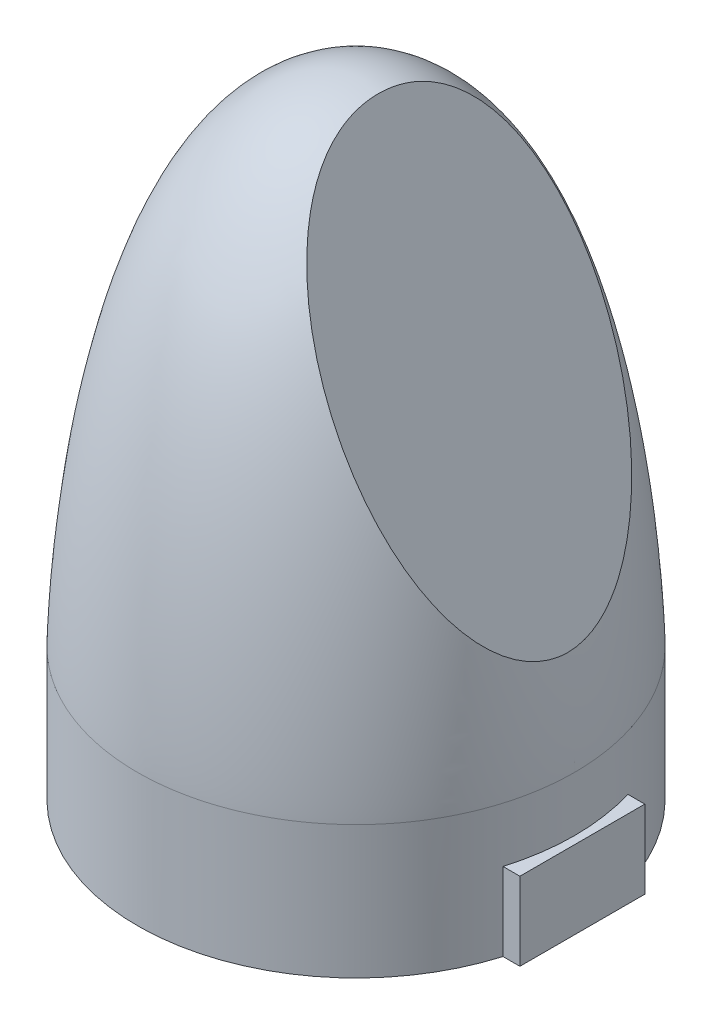
ISO-10303-21;
HEADER;
FILE_DESCRIPTION(('STEP AP214'),'2;1');
FILE_NAME('part.step','',(''),(''),'','','');
FILE_SCHEMA(('AUTOMOTIVE_DESIGN { 1 0 10303 214 1 1 1 1 }'));
ENDSEC;
DATA;
#1=APPLICATION_CONTEXT('core data for automotive mechanical design processes');
#2=APPLICATION_PROTOCOL_DEFINITION('international standard','automotive_design',2000,#1);
#3=PRODUCT_CONTEXT('',#1,'mechanical');
#4=PRODUCT('Part','Part','',(#3));
#5=PRODUCT_RELATED_PRODUCT_CATEGORY('part','',(#4));
#6=PRODUCT_DEFINITION_FORMATION('','',#4);
#7=PRODUCT_DEFINITION_CONTEXT('part definition',#1,'design');
#8=PRODUCT_DEFINITION('design','',#6,#7);
#9=PRODUCT_DEFINITION_SHAPE('','',#8);
#10=(LENGTH_UNIT() NAMED_UNIT(*) SI_UNIT(.MILLI.,.METRE.));
#11=(NAMED_UNIT(*) PLANE_ANGLE_UNIT() SI_UNIT($,.RADIAN.));
#12=(NAMED_UNIT(*) SI_UNIT($,.STERADIAN.) SOLID_ANGLE_UNIT());
#13=UNCERTAINTY_MEASURE_WITH_UNIT(LENGTH_MEASURE(1.E-05),#10,'distance_accuracy_value','');
#14=(GEOMETRIC_REPRESENTATION_CONTEXT(3) GLOBAL_UNCERTAINTY_ASSIGNED_CONTEXT((#13)) GLOBAL_UNIT_ASSIGNED_CONTEXT((#10,
#11,#12)) REPRESENTATION_CONTEXT('',''));
#15=CARTESIAN_POINT('',(0.,0.,0.));
#16=DIRECTION('',(0.,0.,1.));
#17=DIRECTION('',(1.,0.,0.));
#18=AXIS2_PLACEMENT_3D('',#15,#16,#17);
#19=CARTESIAN_POINT('',(0.,-7.91303002861502,1.63207319706783E-06));
#20=DIRECTION('',(0.,-1.,0.));
#21=DIRECTION('',(0.,0.,-1.));
#22=AXIS2_PLACEMENT_3D('',#19,#20,#21);
#23=PLANE('',#22);
#24=CARTESIAN_POINT('',(0.,-7.91303002861502,1.63207319706783E-06));
#25=DIRECTION('',(0.,-1.,0.));
#26=DIRECTION('',(0.,0.,-1.));
#27=AXIS2_PLACEMENT_3D('',#24,#25,#26);
#28=CIRCLE('',#27,14.);
#29=CARTESIAN_POINT('',(13.4164083515888,-7.91303002861502,4.00000000000001));
#30=VERTEX_POINT('',#29);
#31=CARTESIAN_POINT('',(13.4164073784084,-7.91303002861502,-3.99999999999999));
#32=VERTEX_POINT('',#31);
#33=EDGE_CURVE('E131',#30,#32,#28,.T.);
#34=ORIENTED_EDGE('',*,*,#33,.T.);
#35=DIRECTION('',(1.,0.,0.));
#36=VECTOR('',#35,1.);
#37=CARTESIAN_POINT('',(14.5,-7.91303002861502,-4.));
#38=LINE('',#37,#36);
#39=CARTESIAN_POINT('',(14.5,-7.91303002861502,-4.));
#40=VERTEX_POINT('',#39);
#41=EDGE_CURVE('E97',#32,#40,#38,.T.);
#42=ORIENTED_EDGE('',*,*,#41,.T.);
#43=DIRECTION('',(0.,0.,1.));
#44=VECTOR('',#43,1.);
#45=CARTESIAN_POINT('',(14.5,-7.91303002861502,-4.));
#46=LINE('',#45,#44);
#47=CARTESIAN_POINT('',(14.5,-7.91303002861502,4.00000000000001));
#48=VERTEX_POINT('',#47);
#49=EDGE_CURVE('E102',#40,#48,#46,.T.);
#50=ORIENTED_EDGE('',*,*,#49,.T.);
#51=DIRECTION('',(-1.,0.,0.));
#52=VECTOR('',#51,1.);
#53=CARTESIAN_POINT('',(14.5,-7.91303002861502,4.00000000000001));
#54=LINE('',#53,#52);
#55=EDGE_CURVE('E49',#48,#30,#54,.T.);
#56=ORIENTED_EDGE('',*,*,#55,.T.);
#57=EDGE_LOOP('',(#34,#42,#50,#56));
#58=FACE_BOUND('',#57,.T.);
#59=ADVANCED_FACE('F35',(#58),#23,.T.);
#60=CARTESIAN_POINT('',(0.,-7.91303002861502,1.63207319706783E-06));
#61=DIRECTION('',(0.,-1.,0.));
#62=DIRECTION('',(0.,0.,-1.));
#63=AXIS2_PLACEMENT_3D('',#60,#61,#62);
#64=CYLINDRICAL_SURFACE('',#63,14.);
#65=DIRECTION('',(0.,-1.,0.));
#66=VECTOR('',#65,1.);
#67=CARTESIAN_POINT('',(13.4164073784084,-7.91303002861502,-3.99999999999999));
#68=LINE('',#67,#66);
#69=CARTESIAN_POINT('',(13.4164073784084,-2.91303002861502,-3.99999999999999));
#70=VERTEX_POINT('',#69);
#71=EDGE_CURVE('E11',#32,#70,#68,.F.);
#72=ORIENTED_EDGE('',*,*,#71,.F.);
#73=ORIENTED_EDGE('',*,*,#33,.F.);
#74=DIRECTION('',(0.,-1.,0.));
#75=VECTOR('',#74,1.);
#76=CARTESIAN_POINT('',(13.4164083515888,-7.91303002861502,4.00000000000001));
#77=LINE('',#76,#75);
#78=CARTESIAN_POINT('',(13.4164083515888,-2.91303002861502,4.00000000000001));
#79=VERTEX_POINT('',#78);
#80=EDGE_CURVE('E42',#79,#30,#77,.T.);
#81=ORIENTED_EDGE('',*,*,#80,.F.);
#82=CARTESIAN_POINT('',(0.,-2.91303002861502,1.63207319706783E-06));
#83=DIRECTION('',(0.,-1.,0.));
#84=DIRECTION('',(0.,0.,-1.));
#85=AXIS2_PLACEMENT_3D('',#82,#83,#84);
#86=CIRCLE('',#85,14.);
#87=EDGE_CURVE('E92',#79,#70,#86,.F.);
#88=ORIENTED_EDGE('',*,*,#87,.T.);
#89=EDGE_LOOP('',(#72,#73,#81,#88));
#90=FACE_BOUND('',#89,.T.);
#91=CARTESIAN_POINT('',(0.,0.599554023441105,1.63207319706783E-06));
#92=DIRECTION('',(0.,-1.,0.));
#93=DIRECTION('',(0.,0.,-1.));
#94=AXIS2_PLACEMENT_3D('',#91,#92,#93);
#95=CIRCLE('',#94,14.);
#96=CARTESIAN_POINT('',(0.,0.599554023441105,-13.9999983679268));
#97=VERTEX_POINT('',#96);
#98=EDGE_CURVE('E105',#97,#97,#95,.T.);
#99=ORIENTED_EDGE('',*,*,#98,.T.);
#100=EDGE_LOOP('',(#99));
#101=FACE_BOUND('',#100,.T.);
#102=ADVANCED_FACE('F121',(#90,#101),#64,.T.);
#103=CARTESIAN_POINT('',(14.,0.599554023441091,1.63207319706783E-06));
#104=CARTESIAN_POINT('',(14.0101192378029,0.600297963765106,1.63207319706783E-06));
#105=CARTESIAN_POINT('',(13.497519718667,32.0535501950033,1.63207319706783E-06));
#106=CARTESIAN_POINT('',(0.,32.086969971385,1.63207319706783E-06));
#107=B_SPLINE_CURVE_WITH_KNOTS('',3,(#103,#104,#105,#106),.UNSPECIFIED.,.F.,.F.,(4,4),(0.,
0.166417438268429),.UNSPECIFIED.);
#108=CARTESIAN_POINT('',(0.,-7.91303002861502,1.63207319706783E-06));
#109=DIRECTION('',(0.,-1.,0.));
#110=AXIS1_PLACEMENT('',#108,#109);
#111=SURFACE_OF_REVOLUTION('',#107,#110);
#112=CARTESIAN_POINT('',(13.5695925705618,7.03495349548713,1.63207319706783E-06));
#113=CARTESIAN_POINT('',(13.569593111081,7.03495238615009,-0.115935962691736));
#114=CARTESIAN_POINT('',(13.5677017376389,7.03883415783024,-0.231863789741345));
#115=CARTESIAN_POINT('',(13.5601689966265,7.05429402421619,-0.463113613480936));
#116=CARTESIAN_POINT('',(13.554526715549,7.06587399376377,-0.57843545569004));
#117=CARTESIAN_POINT('',(13.5395854771663,7.09653873433856,-0.807815068448769));
#118=CARTESIAN_POINT('',(13.5302870646289,7.11562238730826,-0.921873024716839));
#119=CARTESIAN_POINT('',(13.5081808067805,7.16099229873516,-1.14820576316821));
#120=CARTESIAN_POINT('',(13.4953725740684,7.18727935227742,-1.26048034706125));
#121=CARTESIAN_POINT('',(13.4641002184667,7.25146135962925,-1.50069596285211));
#122=CARTESIAN_POINT('',(13.445057217935,7.290544376454,-1.62824524834484));
#123=CARTESIAN_POINT('',(13.4028369903689,7.37719531476394,-1.87970464842254));
#124=CARTESIAN_POINT('',(13.3796594396676,7.4247639005289,-2.00361447721312));
#125=CARTESIAN_POINT('',(13.3044455699655,7.57912953897566,-2.36935766905935));
#126=CARTESIAN_POINT('',(13.246734797026,7.69757259137201,-2.60515453007807));
#127=CARTESIAN_POINT('',(13.0792809463252,8.04124751032234,-3.20033229330516));
#128=CARTESIAN_POINT('',(12.9595386182557,8.28700139846505,-3.54503548701057));
#129=CARTESIAN_POINT('',(12.7636289989305,8.68907768552191,-4.02670415129678));
#130=CARTESIAN_POINT('',(12.6954726018878,8.82895887745364,-4.18160892362818));
#131=CARTESIAN_POINT('',(12.5545870920375,9.11810610205571,-4.48024095883491));
#132=CARTESIAN_POINT('',(12.4818581996817,9.26737168228025,-4.62396875983492));
#133=CARTESIAN_POINT('',(12.2844743172951,9.67247368200985,-4.99014958880977));
#134=CARTESIAN_POINT('',(12.1565984209263,9.93492054803463,-5.20354939246708));
#135=CARTESIAN_POINT('',(11.8932504340534,10.4754043748651,-5.60440398331515));
#136=CARTESIAN_POINT('',(11.7577734255069,10.7534514292443,-5.79184169415517));
#137=CARTESIAN_POINT('',(11.4809120363106,11.3216695687154,-6.14336078578195));
#138=CARTESIAN_POINT('',(11.3395195596337,11.6118572697371,-6.30740870595594));
#139=CARTESIAN_POINT('',(11.0523536226196,12.2012240099798,-6.61387427767249));
#140=CARTESIAN_POINT('',(10.9065806627114,12.5004020221419,-6.75629438882122));
#141=CARTESIAN_POINT('',(10.6372145804181,13.0532371233513,-6.99819389175374));
#142=CARTESIAN_POINT('',(10.5141615078226,13.3057858379604,-7.10083629662205));
#143=CARTESIAN_POINT('',(10.266126712572,13.8148415437434,-7.2932553568146));
#144=CARTESIAN_POINT('',(10.1411447494743,14.0713490283912,-7.38303039359384));
#145=CARTESIAN_POINT('',(9.88955921589693,14.5876921133629,-7.55034430684583));
#146=CARTESIAN_POINT('',(9.76295491160109,14.8475292197389,-7.62787741847709));
#147=CARTESIAN_POINT('',(9.50846584128399,15.3698313958245,-7.77113080345647));
#148=CARTESIAN_POINT('',(9.38058093973396,15.6322967436874,-7.83684981223705));
#149=CARTESIAN_POINT('',(8.99480154315081,16.4240534115604,-8.01711777693927));
#150=CARTESIAN_POINT('',(8.73532783324459,16.9565858427259,-8.11441970486723));
#151=CARTESIAN_POINT('',(8.21402709922825,18.0264805436358,-8.26468524020296));
#152=CARTESIAN_POINT('',(7.9522006932991,18.5638415446527,-8.31766016917724));
#153=CARTESIAN_POINT('',(7.50750902556991,19.4765071670022,-8.3699952668589));
#154=CARTESIAN_POINT('',(7.3248886181778,19.851309259916,-8.38077243905584));
#155=CARTESIAN_POINT('',(6.95961564994763,20.600979436062,-8.38055717645193));
#156=CARTESIAN_POINT('',(6.77696308799601,20.9758475215797,-8.36956194015509));
#157=CARTESIAN_POINT('',(6.41209728568607,21.7246820482973,-8.32505448639336));
#158=CARTESIAN_POINT('',(6.2298842785092,22.0986480109258,-8.29153219449331));
#159=CARTESIAN_POINT('',(5.86728178438736,22.8428374234531,-8.20100542017854));
#160=CARTESIAN_POINT('',(5.68688796714474,23.2130697606643,-8.14409244609434));
#161=CARTESIAN_POINT('',(5.32801042257246,23.9496142505506,-8.00526690446767));
#162=CARTESIAN_POINT('',(5.14952600360483,24.3159278227131,-7.92336372996598));
#163=CARTESIAN_POINT('',(4.79546508716638,25.0425868768416,-7.73257352089771));
#164=CARTESIAN_POINT('',(4.61988621207603,25.4029372385294,-7.62370984497012));
#165=CARTESIAN_POINT('',(4.32539240445965,26.0073433781334,-7.41386222117222));
#166=CARTESIAN_POINT('',(4.20543298191147,26.2535428214368,-7.32049117738945));
#167=CARTESIAN_POINT('',(3.96803166737841,26.7407748390308,-7.11829744784054));
#168=CARTESIAN_POINT('',(3.8505895611237,26.9818078530792,-7.00947608323993));
#169=CARTESIAN_POINT('',(3.61893639897148,27.4572426155169,-6.77520540763167));
#170=CARTESIAN_POINT('',(3.50472486699324,27.6916453409934,-6.64975856232959));
#171=CARTESIAN_POINT('',(3.28041196295403,28.1520152804874,-6.38092333942188));
#172=CARTESIAN_POINT('',(3.17031008170108,28.3779835395481,-6.23753719416755));
#173=CARTESIAN_POINT('',(2.97233370093599,28.7843015568928,-5.95566371149793));
#174=CARTESIAN_POINT('',(2.88369496884013,28.9662197925226,-5.81997899186252));
#175=CARTESIAN_POINT('',(2.71097024865626,29.3207124121993,-5.53417658929666));
#176=CARTESIAN_POINT('',(2.62688431465721,29.4932866852365,-5.3840587349539));
#177=CARTESIAN_POINT('',(2.46439058944298,29.8267816607728,-5.06903302195973));
#178=CARTESIAN_POINT('',(2.38597475201658,29.9877188769619,-4.90414689556671));
#179=CARTESIAN_POINT('',(2.23585880587704,30.295810243071,-4.55912921760212));
#180=CARTESIAN_POINT('',(2.16415669826374,30.4429684954458,-4.37900223433969));
#181=CARTESIAN_POINT('',(2.04407670479046,30.6894153932135,-4.04623563313655));
#182=CARTESIAN_POINT('',(1.99409396407966,30.7919977721245,-3.89660869369195));
#183=CARTESIAN_POINT('',(1.89950679623883,30.9861243156789,-3.58873506093898));
#184=CARTESIAN_POINT('',(1.85490163983911,31.0776699770434,-3.43048954065627));
#185=CARTESIAN_POINT('',(1.77167157698174,31.2484876977887,-3.10613254633115));
#186=CARTESIAN_POINT('',(1.73304254743913,31.3277682192077,-2.94002659965607));
#187=CARTESIAN_POINT('',(1.6622250457882,31.4731109452082,-2.60077902038431));
#188=CARTESIAN_POINT('',(1.63003697730049,31.5391723214165,-2.42763694768865));
#189=CARTESIAN_POINT('',(1.57239630370753,31.6574715049969,-2.07499721271673));
#190=CARTESIAN_POINT('',(1.5469645056908,31.7096666088155,-1.89548180369488));
#191=CARTESIAN_POINT('',(1.50319858550568,31.7994898586808,-1.53204197155543));
#192=CARTESIAN_POINT('',(1.48486287171623,31.8371212713005,-1.34811854697623));
#193=CARTESIAN_POINT('',(1.4553448581792,31.8977027441508,-0.977183425601441));
#194=CARTESIAN_POINT('',(1.44416738569824,31.9206428971117,-0.790169731837354));
#195=CARTESIAN_POINT('',(1.42895044362931,31.9518734798085,-0.414434108559467));
#196=CARTESIAN_POINT('',(1.42491874127721,31.9601479684111,-0.225710544068186));
#197=CARTESIAN_POINT('',(1.42400690458217,31.9620193819436,0.143930900312275));
#198=CARTESIAN_POINT('',(1.42683495728801,31.9562152109413,0.324845403956373));
#199=CARTESIAN_POINT('',(1.43906204675914,31.9311208702295,0.685594032731897));
#200=CARTESIAN_POINT('',(1.44846373484193,31.9118252590726,0.865427692403453));
#201=CARTESIAN_POINT('',(1.47386751976268,31.8596876481002,1.22259303149525));
#202=CARTESIAN_POINT('',(1.48986741936465,31.8268501577952,1.39992552350496));
#203=CARTESIAN_POINT('',(1.52841999257066,31.747726551999,1.75075483186491));
#204=CARTESIAN_POINT('',(1.55096965696794,31.7014466124715,1.92425337037416));
#205=CARTESIAN_POINT('',(1.60251080753621,31.5956658217043,2.26655146825602));
#206=CARTESIAN_POINT('',(1.63151431501456,31.536140298462,2.43534158843063));
#207=CARTESIAN_POINT('',(1.69561194785318,31.4045891356878,2.76659689286819));
#208=CARTESIAN_POINT('',(1.73070079466112,31.3325743296244,2.92906741057632));
#209=CARTESIAN_POINT('',(1.80660384093532,31.1767942554895,3.24703533186243));
#210=CARTESIAN_POINT('',(1.8474225594887,31.0930197126422,3.40252710238237));
#211=CARTESIAN_POINT('',(1.9342792128042,30.9147589371296,3.7057561851056));
#212=CARTESIAN_POINT('',(1.98031889289173,30.8202691224352,3.85349087989193));
#213=CARTESIAN_POINT('',(2.09137058659041,30.5923515100814,4.18314937232851));
#214=CARTESIAN_POINT('',(2.1579714171975,30.455662894292,4.36229317581793));
#215=CARTESIAN_POINT('',(2.29784576848922,30.1685909270472,4.70635476095048));
#216=CARTESIAN_POINT('',(2.37112079142655,30.0182044924345,4.8712693234749));
#217=CARTESIAN_POINT('',(2.59957135235512,29.5493426079053,5.34532503044854));
#218=CARTESIAN_POINT('',(2.7632364540971,29.2134435506978,5.63338815709374));
#219=CARTESIAN_POINT('',(3.06335253823984,28.5974984980057,6.09218704505054));
#220=CARTESIAN_POINT('',(3.19657895696239,28.3240704552054,6.27434608299585));
#221=CARTESIAN_POINT('',(3.46954956358874,27.7638375867734,6.61153737880839));
#222=CARTESIAN_POINT('',(3.60929705867246,27.477025973631,6.76655567858261));
#223=CARTESIAN_POINT('',(3.89375799365458,26.8932108605993,7.0519015053211));
#224=CARTESIAN_POINT('',(4.03847903035531,26.596191769367,7.18218907978723));
#225=CARTESIAN_POINT('',(4.33144124331907,25.9949290072721,7.41996343650344));
#226=CARTESIAN_POINT('',(4.47968223138939,25.690685722648,7.52745143468478));
#227=CARTESIAN_POINT('',(4.74953643860886,25.1368488153067,7.70252116722886));
#228=CARTESIAN_POINT('',(4.8706956287262,24.8881870218073,7.77379676397444));
#229=CARTESIAN_POINT('',(5.1143235547424,24.3881757806371,7.90359441569345));
#230=CARTESIAN_POINT('',(5.2367924458304,24.1368260144631,7.96211494132658));
#231=CARTESIAN_POINT('',(5.60577897053224,23.3795342983281,8.11964016622769));
#232=CARTESIAN_POINT('',(5.85380816803834,22.8704900811097,8.20056527427735));
#233=CARTESIAN_POINT('',(6.3522920829253,21.8474236163507,8.31844954376962));
#234=CARTESIAN_POINT('',(6.6027507181833,21.3333933279313,8.35531861474772));
#235=CARTESIAN_POINT('',(7.10411240815579,20.3044206441446,8.38740792799201));
#236=CARTESIAN_POINT('',(7.35501534963813,19.7894784811699,8.38263758108016));
#237=CARTESIAN_POINT('',(7.86820809565897,18.7362242582516,8.33154894644731));
#238=CARTESIAN_POINT('',(8.13045916712688,18.1979916923587,8.28322423973561));
#239=CARTESIAN_POINT('',(8.65278910521417,17.1259846982756,8.14224487167148));
#240=CARTESIAN_POINT('',(8.91286730109274,16.5922116466843,8.04957700171914));
#241=CARTESIAN_POINT('',(9.29961079452184,15.7984763088434,7.8764022991751));
#242=CARTESIAN_POINT('',(9.42778886701671,15.5354092698263,7.81309245066583));
#243=CARTESIAN_POINT('',(9.68291880517343,15.0117918047705,7.6747310952471));
#244=CARTESIAN_POINT('',(9.80987080234767,14.7512411088216,7.59968086283597));
#245=CARTESIAN_POINT('',(10.0621937686621,14.2333845493308,7.43744414210311));
#246=CARTESIAN_POINT('',(10.1875656885015,13.9760767346159,7.3502653727918));
#247=CARTESIAN_POINT('',(10.4364851752332,13.4652053269437,7.16315043942667));
#248=CARTESIAN_POINT('',(10.5600326245051,13.2116419753856,7.0632134568438));
#249=CARTESIAN_POINT('',(10.8040661526837,12.7107982941748,6.85057826620381));
#250=CARTESIAN_POINT('',(10.92456715733,12.4634873315906,6.73796965042831));
#251=CARTESIAN_POINT('',(11.1628254349411,11.9744965206626,6.49861874455362));
#252=CARTESIAN_POINT('',(11.2805833119411,11.7328154326234,6.37187960224371));
#253=CARTESIAN_POINT('',(11.5128018208414,11.2562203773825,6.1031370649898));
#254=CARTESIAN_POINT('',(11.6272606786049,11.0213100513411,5.96112564425124));
#255=CARTESIAN_POINT('',(11.8519750623534,10.560116132548,5.66067443128469));
#256=CARTESIAN_POINT('',(11.9622311237976,10.3338314408431,5.50223674148624));
#257=CARTESIAN_POINT('',(12.1605913108195,9.92672571641578,5.19372675425537));
#258=CARTESIAN_POINT('',(12.2494613104783,9.74433283741064,5.04622738554583));
#259=CARTESIAN_POINT('',(12.4225816229001,9.38902832162186,4.7375908912396));
#260=CARTESIAN_POINT('',(12.5068313307808,9.21611792627239,4.5764519869635));
#261=CARTESIAN_POINT('',(12.6694427131064,8.88238147645509,4.23993495336355));
#262=CARTESIAN_POINT('',(12.7478153519104,8.7215329192187,4.06458467704947));
#263=CARTESIAN_POINT('',(12.8973860850233,8.41456052434844,3.69876743748846));
#264=CARTESIAN_POINT('',(12.9685883297078,8.26842816866593,3.5083093344417));
#265=CARTESIAN_POINT('',(13.1200427664086,7.95758974339257,3.0584135627423));
#266=CARTESIAN_POINT('',(13.1976275609072,7.79835812316113,2.79414473234098));
#267=CARTESIAN_POINT('',(13.2999280962746,7.58840100331087,2.37992786858826));
#268=CARTESIAN_POINT('',(13.3316784206356,7.52323803389727,2.23890935830274));
#269=CARTESIAN_POINT('',(13.3899211837091,7.40370314834548,1.95127658335797));
#270=CARTESIAN_POINT('',(13.4164142190157,7.34933000778398,1.8046629558832));
#271=CARTESIAN_POINT('',(13.4609372672647,7.25795286157722,1.52307037300803));
#272=CARTESIAN_POINT('',(13.4795788535589,7.21969368968032,1.38859514756734));
#273=CARTESIAN_POINT('',(13.5118472849967,7.15346738008702,1.1165488122648));
#274=CARTESIAN_POINT('',(13.5254750345172,7.12549838628728,0.978978265480491));
#275=CARTESIAN_POINT('',(13.5474031260014,7.0804941356726,0.701736180914162));
#276=CARTESIAN_POINT('',(13.5557073238617,7.06345096518501,0.562066238959865));
#277=CARTESIAN_POINT('',(13.5668013644393,7.0406820441885,0.281593175660219));
#278=CARTESIAN_POINT('',(13.5695919141836,7.0349548426082,0.140790201931328));
#279=CARTESIAN_POINT('',(13.5695925705618,7.03495349548713,1.63207319706783E-06));
#280=B_SPLINE_CURVE_WITH_KNOTS('',3,(#112,#113,#114,#115,#116,#117,#118,#119,#120,#121,#122,
#123,#124,#125,#126,#127,#128,#129,#130,#131,#132,#133,#134,#135,#136,#137,#138,#139,#140,#141,
#142,#143,#144,#145,#146,#147,#148,#149,#150,#151,#152,#153,#154,#155,#156,#157,#158,#159,#160,
#161,#162,#163,#164,#165,#166,#167,#168,#169,#170,#171,#172,#173,#174,#175,#176,#177,#178,#179,
#180,#181,#182,#183,#184,#185,#186,#187,#188,#189,#190,#191,#192,#193,#194,#195,#196,#197,#198,
#199,#200,#201,#202,#203,#204,#205,#206,#207,#208,#209,#210,#211,#212,#213,#214,#215,#216,#217,
#218,#219,#220,#221,#222,#223,#224,#225,#226,#227,#228,#229,#230,#231,#232,#233,#234,#235,#236,
#237,#238,#239,#240,#241,#242,#243,#244,#245,#246,#247,#248,#249,#250,#251,#252,#253,#254,#255,
#256,#257,#258,#259,#260,#261,#262,#263,#264,#265,#266,#267,#268,#269,#270,#271,#272,#273,#274,
#275,#276,#277,#278,#279),.UNSPECIFIED.,.T.,.F.,(4,2,2,2,2,2,2,2,2,2,2,2,2,2,2,2,2,2,2,2,2,2,2,
2,2,2,2,2,2,2,2,2,2,2,2,2,2,2,2,2,2,2,2,2,2,2,2,2,2,2,2,2,2,2,2,2,2,2,2,2,2,2,2,2,2,2,2,2,2,2,2,
2,2,2,2,2,2,2,2,2,2,2,2,4),(0.,0.347716159295487,0.695517033447526,1.04326610449338,
1.39105357428383,1.79489885053381,2.19877575507835,3.00668561334551,4.31863896660072,
4.97698506260486,5.63529944233445,6.71845257087879,7.80231478519259,8.88771230315853,
9.9729862925272,10.869959226273,11.7670448885374,12.6645517452688,13.5621546129397,
15.361236622299,17.1598589874283,18.4105347677635,19.6613714853184,20.9127679683081,
22.1593146846205,23.4053934386869,24.6503963412783,25.5180391595039,26.3856078297446,
27.2530479755795,28.1203802850605,28.8507355379243,29.5810994657818,30.3104057509034,
31.0394942022567,31.6034758257574,32.1673808798473,32.7308951293137,33.2944446801544,
33.8597101705905,34.4248488008347,34.9903681405291,35.5565018065167,36.0989775852064,
36.6416722847401,37.184186410088,37.7264516773611,38.2697355829064,38.8125505682474,
39.3557960966384,39.8992237659745,40.6030565974783,41.3070482437074,42.7165081976705,
43.7788479284005,44.8417324105679,45.9063196353858,46.9708500700895,47.827470522614,
48.6841936279862,50.3981235060452,52.1155522446967,53.8325928415745,55.6330171013461,
57.4339779917843,58.3319896268071,59.2299038441365,60.1272491907471,61.0246521373281,
61.9160675712029,62.8072848240269,63.6989727339226,64.5905466555466,65.3425542907281,
66.0946601438667,66.8453260200137,67.5955548668726,68.5462965756788,69.0215234510275,
69.4966963670369,69.919381622714,70.3419905986029,70.7642931281065,71.18654150132),.UNSPECIFIED.);
#281=CARTESIAN_POINT('',(13.5695925705618,7.03495349548713,1.63207319706783E-06));
#282=VERTEX_POINT('',#281);
#283=EDGE_CURVE('E126',#282,#282,#280,.T.);
#284=ORIENTED_EDGE('',*,*,#283,.F.);
#285=EDGE_LOOP('',(#284));
#286=FACE_BOUND('',#285,.T.);
#287=CARTESIAN_POINT('',(0.,32.086969971385,1.63207319706783E-06));
#288=VERTEX_POINT('',#287);
#289=VERTEX_LOOP('',#288);
#290=FACE_BOUND('',#289,.T.);
#291=ORIENTED_EDGE('',*,*,#98,.F.);
#292=EDGE_LOOP('',(#291));
#293=FACE_BOUND('',#292,.T.);
#294=ADVANCED_FACE('F116',(#286,#290,#293),#111,.F.);
#295=CARTESIAN_POINT('',(1.42440752605615,31.9611971640488,-14.0050579868282));
#296=DIRECTION('',(-0.898966715538194,-0.438016945282341,0.));
#297=DIRECTION('',(0.438016945282341,-0.898966715538194,0.));
#298=AXIS2_PLACEMENT_3D('',#295,#296,#297);
#299=PLANE('',#298);
#300=ORIENTED_EDGE('',*,*,#283,.T.);
#301=EDGE_LOOP('',(#300));
#302=FACE_BOUND('',#301,.T.);
#303=ADVANCED_FACE('F120',(#302),#299,.F.);
#304=CARTESIAN_POINT('',(14.5,-2.91303002861502,-4.));
#305=DIRECTION('',(1.,0.,0.));
#306=DIRECTION('',(0.,0.,-1.));
#307=AXIS2_PLACEMENT_3D('',#304,#305,#306);
#308=PLANE('',#307);
#309=ORIENTED_EDGE('',*,*,#49,.F.);
#310=DIRECTION('',(0.,-1.,0.));
#311=VECTOR('',#310,1.);
#312=CARTESIAN_POINT('',(14.5,-2.91303002861502,-4.));
#313=LINE('',#312,#311);
#314=CARTESIAN_POINT('',(14.5,-2.91303002861502,-4.));
#315=VERTEX_POINT('',#314);
#316=EDGE_CURVE('E83',#315,#40,#313,.T.);
#317=ORIENTED_EDGE('',*,*,#316,.F.);
#318=DIRECTION('',(0.,0.,1.));
#319=VECTOR('',#318,1.);
#320=CARTESIAN_POINT('',(14.5,-2.91303002861502,-4.));
#321=LINE('',#320,#319);
#322=CARTESIAN_POINT('',(14.5,-2.91303002861502,4.00000000000001));
#323=VERTEX_POINT('',#322);
#324=EDGE_CURVE('E90',#315,#323,#321,.T.);
#325=ORIENTED_EDGE('',*,*,#324,.T.);
#326=DIRECTION('',(0.,-1.,0.));
#327=VECTOR('',#326,1.);
#328=CARTESIAN_POINT('',(14.5,-2.91303002861502,4.00000000000001));
#329=LINE('',#328,#327);
#330=EDGE_CURVE('E75',#323,#48,#329,.T.);
#331=ORIENTED_EDGE('',*,*,#330,.T.);
#332=EDGE_LOOP('',(#309,#317,#325,#331));
#333=FACE_BOUND('',#332,.T.);
#334=ADVANCED_FACE('F95',(#333),#308,.T.);
#335=CARTESIAN_POINT('',(14.5,-2.91303002861502,-4.));
#336=DIRECTION('',(0.,0.,-1.));
#337=DIRECTION('',(-1.,0.,0.));
#338=AXIS2_PLACEMENT_3D('',#335,#336,#337);
#339=PLANE('',#338);
#340=ORIENTED_EDGE('',*,*,#41,.F.);
#341=ORIENTED_EDGE('',*,*,#71,.T.);
#342=DIRECTION('',(1.,0.,0.));
#343=VECTOR('',#342,1.);
#344=CARTESIAN_POINT('',(14.5,-2.91303002861502,-4.));
#345=LINE('',#344,#343);
#346=EDGE_CURVE('E84',#70,#315,#345,.T.);
#347=ORIENTED_EDGE('',*,*,#346,.T.);
#348=ORIENTED_EDGE('',*,*,#316,.T.);
#349=EDGE_LOOP('',(#340,#341,#347,#348));
#350=FACE_BOUND('',#349,.T.);
#351=ADVANCED_FACE('F154',(#350),#339,.T.);
#352=CARTESIAN_POINT('',(14.5,-2.91303002861502,4.00000000000001));
#353=DIRECTION('',(0.,0.,1.));
#354=DIRECTION('',(1.,0.,0.));
#355=AXIS2_PLACEMENT_3D('',#352,#353,#354);
#356=PLANE('',#355);
#357=DIRECTION('',(-1.,0.,0.));
#358=VECTOR('',#357,1.);
#359=CARTESIAN_POINT('',(14.5,-2.91303002861502,4.00000000000001));
#360=LINE('',#359,#358);
#361=EDGE_CURVE('E78',#323,#79,#360,.T.);
#362=ORIENTED_EDGE('',*,*,#361,.T.);
#363=ORIENTED_EDGE('',*,*,#80,.T.);
#364=ORIENTED_EDGE('',*,*,#55,.F.);
#365=ORIENTED_EDGE('',*,*,#330,.F.);
#366=EDGE_LOOP('',(#362,#363,#364,#365));
#367=FACE_BOUND('',#366,.T.);
#368=ADVANCED_FACE('F77',(#367),#356,.T.);
#369=CARTESIAN_POINT('',(0.,-2.91303002861502,0.));
#370=DIRECTION('',(0.,-1.,0.));
#371=DIRECTION('',(0.,0.,-1.));
#372=AXIS2_PLACEMENT_3D('',#369,#370,#371);
#373=PLANE('',#372);
#374=ORIENTED_EDGE('',*,*,#87,.F.);
#375=ORIENTED_EDGE('',*,*,#361,.F.);
#376=ORIENTED_EDGE('',*,*,#324,.F.);
#377=ORIENTED_EDGE('',*,*,#346,.F.);
#378=EDGE_LOOP('',(#374,#375,#376,#377));
#379=FACE_BOUND('',#378,.T.);
#380=ADVANCED_FACE('F88',(#379),#373,.F.);
#381=CLOSED_SHELL('',(#59,#102,#294,#303,#334,#351,#368,#380));
#382=MANIFOLD_SOLID_BREP('B2',#381);
#383=ADVANCED_BREP_SHAPE_REPRESENTATION('',(#18,#382),#14);
#384=SHAPE_DEFINITION_REPRESENTATION(#9,#383);
ENDSEC;
END-ISO-10303-21;
